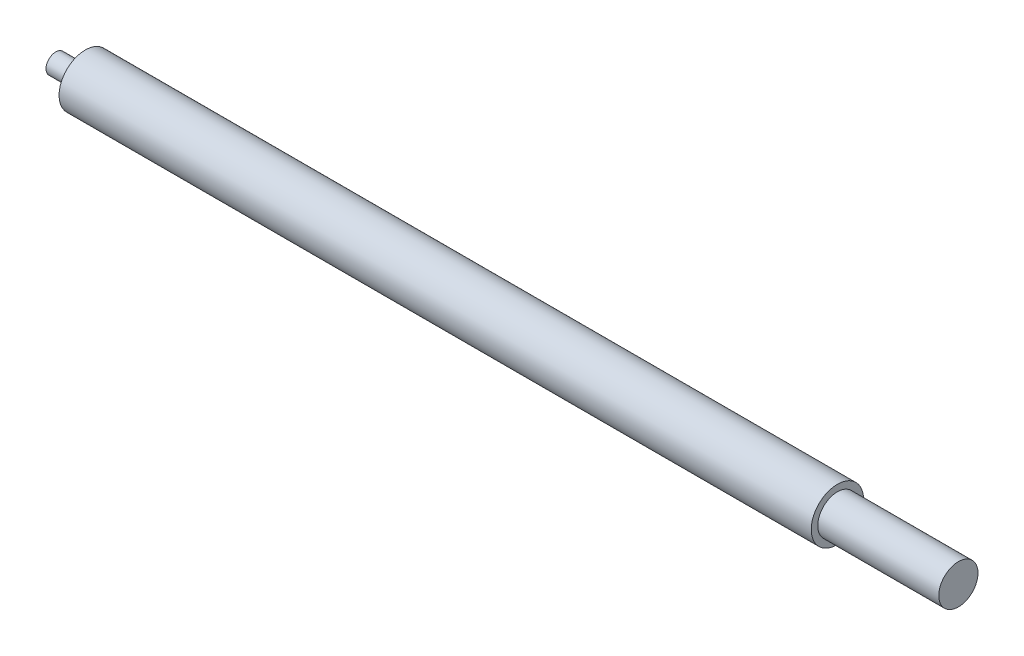
ISO-10303-21;
HEADER;
FILE_DESCRIPTION(('STEP AP214'),'2;1');
FILE_NAME('part.step','',(''),(''),'','','');
FILE_SCHEMA(('AUTOMOTIVE_DESIGN { 1 0 10303 214 1 1 1 1 }'));
ENDSEC;
DATA;
#1=APPLICATION_CONTEXT('core data for automotive mechanical design processes');
#2=APPLICATION_PROTOCOL_DEFINITION('international standard','automotive_design',2000,#1);
#3=PRODUCT_CONTEXT('',#1,'mechanical');
#4=PRODUCT('Part','Part','',(#3));
#5=PRODUCT_RELATED_PRODUCT_CATEGORY('part','',(#4));
#6=PRODUCT_DEFINITION_FORMATION('','',#4);
#7=PRODUCT_DEFINITION_CONTEXT('part definition',#1,'design');
#8=PRODUCT_DEFINITION('design','',#6,#7);
#9=PRODUCT_DEFINITION_SHAPE('','',#8);
#10=(LENGTH_UNIT() NAMED_UNIT(*) SI_UNIT(.MILLI.,.METRE.));
#11=(NAMED_UNIT(*) PLANE_ANGLE_UNIT() SI_UNIT($,.RADIAN.));
#12=(NAMED_UNIT(*) SI_UNIT($,.STERADIAN.) SOLID_ANGLE_UNIT());
#13=UNCERTAINTY_MEASURE_WITH_UNIT(LENGTH_MEASURE(1.E-05),#10,'distance_accuracy_value','');
#14=(GEOMETRIC_REPRESENTATION_CONTEXT(3) GLOBAL_UNCERTAINTY_ASSIGNED_CONTEXT((#13)) GLOBAL_UNIT_ASSIGNED_CONTEXT((#10,
#11,#12)) REPRESENTATION_CONTEXT('',''));
#15=CARTESIAN_POINT('',(0.,0.,0.));
#16=DIRECTION('',(0.,0.,1.));
#17=DIRECTION('',(1.,0.,0.));
#18=AXIS2_PLACEMENT_3D('',#15,#16,#17);
#19=CARTESIAN_POINT('',(115.,0.,0.));
#20=DIRECTION('',(-1.,0.,0.));
#21=DIRECTION('',(0.,0.,1.));
#22=AXIS2_PLACEMENT_3D('',#19,#20,#21);
#23=CYLINDRICAL_SURFACE('',#22,8.);
#24=CARTESIAN_POINT('',(115.,0.,0.));
#25=DIRECTION('',(1.,0.,0.));
#26=DIRECTION('',(0.,0.,-1.));
#27=AXIS2_PLACEMENT_3D('',#24,#25,#26);
#28=CIRCLE('',#27,8.);
#29=CARTESIAN_POINT('',(115.,0.,-8.));
#30=VERTEX_POINT('',#29);
#31=EDGE_CURVE('E45',#30,#30,#28,.T.);
#32=ORIENTED_EDGE('',*,*,#31,.F.);
#33=EDGE_LOOP('',(#32));
#34=FACE_BOUND('',#33,.T.);
#35=CARTESIAN_POINT('',(-115.,0.,0.));
#36=DIRECTION('',(1.,0.,0.));
#37=DIRECTION('',(0.,0.,-1.));
#38=AXIS2_PLACEMENT_3D('',#35,#36,#37);
#39=CIRCLE('',#38,8.);
#40=CARTESIAN_POINT('',(-115.,0.,-8.));
#41=VERTEX_POINT('',#40);
#42=EDGE_CURVE('E50',#41,#41,#39,.T.);
#43=ORIENTED_EDGE('',*,*,#42,.T.);
#44=EDGE_LOOP('',(#43));
#45=FACE_BOUND('',#44,.T.);
#46=ADVANCED_FACE('F35',(#34,#45),#23,.T.);
#47=CARTESIAN_POINT('',(115.,0.,0.));
#48=DIRECTION('',(1.,0.,0.));
#49=DIRECTION('',(0.,0.,-1.));
#50=AXIS2_PLACEMENT_3D('',#47,#48,#49);
#51=PLANE('',#50);
#52=CARTESIAN_POINT('',(115.,0.,0.));
#53=DIRECTION('',(1.,0.,0.));
#54=DIRECTION('',(0.,0.,-1.));
#55=AXIS2_PLACEMENT_3D('',#52,#53,#54);
#56=CIRCLE('',#55,6.);
#57=CARTESIAN_POINT('',(115.,0.,-6.));
#58=VERTEX_POINT('',#57);
#59=EDGE_CURVE('E41',#58,#58,#56,.T.);
#60=ORIENTED_EDGE('',*,*,#59,.F.);
#61=EDGE_LOOP('',(#60));
#62=FACE_BOUND('',#61,.T.);
#63=ORIENTED_EDGE('',*,*,#31,.T.);
#64=EDGE_LOOP('',(#63));
#65=FACE_BOUND('',#64,.T.);
#66=ADVANCED_FACE('F79',(#62,#65),#51,.T.);
#67=CARTESIAN_POINT('',(-115.,0.,0.));
#68=DIRECTION('',(1.,0.,0.));
#69=DIRECTION('',(0.,0.,-1.));
#70=AXIS2_PLACEMENT_3D('',#67,#68,#69);
#71=PLANE('',#70);
#72=CARTESIAN_POINT('',(-115.,-1.36409416228561E-11,-8.86429437235242E-12));
#73=DIRECTION('',(1.,0.,0.));
#74=DIRECTION('',(0.,0.,-1.));
#75=AXIS2_PLACEMENT_3D('',#72,#73,#74);
#76=CIRCLE('',#75,3.00000000001337);
#77=CARTESIAN_POINT('',(-115.,-1.36409416228561E-11,-3.00000000002223));
#78=VERTEX_POINT('',#77);
#79=EDGE_CURVE('E10',#78,#78,#76,.F.);
#80=ORIENTED_EDGE('',*,*,#79,.F.);
#81=EDGE_LOOP('',(#80));
#82=FACE_BOUND('',#81,.T.);
#83=ORIENTED_EDGE('',*,*,#42,.F.);
#84=EDGE_LOOP('',(#83));
#85=FACE_BOUND('',#84,.T.);
#86=ADVANCED_FACE('F84',(#82,#85),#71,.F.);
#87=CARTESIAN_POINT('',(152.,0.,0.));
#88=DIRECTION('',(-1.,0.,0.));
#89=DIRECTION('',(0.,0.,1.));
#90=AXIS2_PLACEMENT_3D('',#87,#88,#89);
#91=CYLINDRICAL_SURFACE('',#90,6.);
#92=CARTESIAN_POINT('',(152.,0.,0.));
#93=DIRECTION('',(1.,0.,0.));
#94=DIRECTION('',(0.,0.,-1.));
#95=AXIS2_PLACEMENT_3D('',#92,#93,#94);
#96=CIRCLE('',#95,6.);
#97=CARTESIAN_POINT('',(152.,0.,-6.));
#98=VERTEX_POINT('',#97);
#99=EDGE_CURVE('E53',#98,#98,#96,.T.);
#100=ORIENTED_EDGE('',*,*,#99,.F.);
#101=EDGE_LOOP('',(#100));
#102=FACE_BOUND('',#101,.T.);
#103=ORIENTED_EDGE('',*,*,#59,.T.);
#104=EDGE_LOOP('',(#103));
#105=FACE_BOUND('',#104,.T.);
#106=ADVANCED_FACE('F76',(#102,#105),#91,.T.);
#107=CARTESIAN_POINT('',(152.,0.,0.));
#108=DIRECTION('',(1.,0.,0.));
#109=DIRECTION('',(0.,0.,-1.));
#110=AXIS2_PLACEMENT_3D('',#107,#108,#109);
#111=PLANE('',#110);
#112=ORIENTED_EDGE('',*,*,#99,.T.);
#113=EDGE_LOOP('',(#112));
#114=FACE_BOUND('',#113,.T.);
#115=ADVANCED_FACE('F69',(#114),#111,.T.);
#116=CARTESIAN_POINT('',(-124.,-1.39316475128825E-11,-9.05302727545665E-12));
#117=DIRECTION('',(1.,0.,0.));
#118=DIRECTION('',(0.,1.,0.));
#119=AXIS2_PLACEMENT_3D('',#116,#117,#118);
#120=CYLINDRICAL_SURFACE('',#119,3.00000000001337);
#121=CARTESIAN_POINT('',(-124.,-1.39316475128825E-11,-9.05302727545665E-12));
#122=DIRECTION('',(-1.,0.,0.));
#123=DIRECTION('',(0.,-1.,0.));
#124=AXIS2_PLACEMENT_3D('',#121,#122,#123);
#125=CIRCLE('',#124,3.00000000001337);
#126=CARTESIAN_POINT('',(-124.,-3.0000000000273,-9.05302727545665E-12));
#127=VERTEX_POINT('',#126);
#128=EDGE_CURVE('E59',#127,#127,#125,.T.);
#129=ORIENTED_EDGE('',*,*,#128,.F.);
#130=EDGE_LOOP('',(#129));
#131=FACE_BOUND('',#130,.T.);
#132=ORIENTED_EDGE('',*,*,#79,.T.);
#133=EDGE_LOOP('',(#132));
#134=FACE_BOUND('',#133,.T.);
#135=ADVANCED_FACE('F67',(#131,#134),#120,.T.);
#136=CARTESIAN_POINT('',(-124.,-1.39316475128825E-11,-9.05302727545665E-12));
#137=DIRECTION('',(-1.,0.,0.));
#138=DIRECTION('',(0.,-1.,0.));
#139=AXIS2_PLACEMENT_3D('',#136,#137,#138);
#140=PLANE('',#139);
#141=ORIENTED_EDGE('',*,*,#128,.T.);
#142=EDGE_LOOP('',(#141));
#143=FACE_BOUND('',#142,.T.);
#144=ADVANCED_FACE('F65',(#143),#140,.T.);
#145=CLOSED_SHELL('',(#46,#66,#86,#106,#115,#135,#144));
#146=MANIFOLD_SOLID_BREP('B2',#145);
#147=ADVANCED_BREP_SHAPE_REPRESENTATION('',(#18,#146),#14);
#148=SHAPE_DEFINITION_REPRESENTATION(#9,#147);
ENDSEC;
END-ISO-10303-21;
